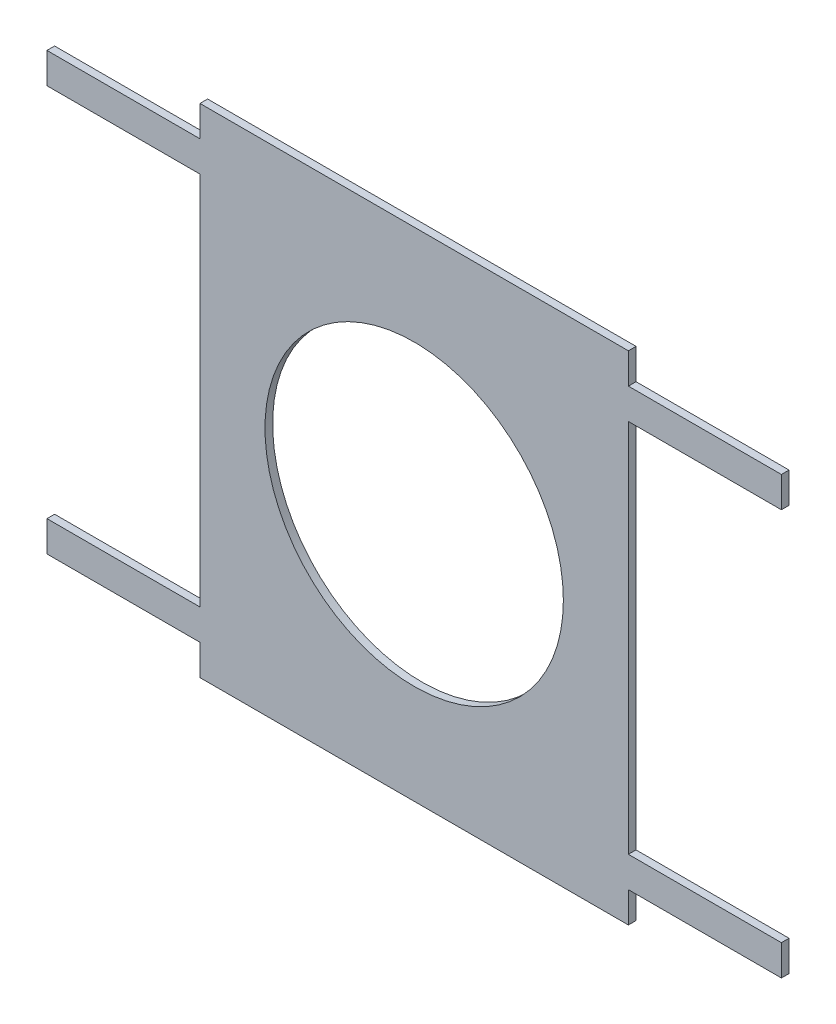
ISO-10303-21;
HEADER;
FILE_DESCRIPTION(('STEP AP214'),'2;1');
FILE_NAME('part.step','',(''),(''),'','','');
FILE_SCHEMA(('AUTOMOTIVE_DESIGN { 1 0 10303 214 1 1 1 1 }'));
ENDSEC;
DATA;
#1=APPLICATION_CONTEXT('core data for automotive mechanical design processes');
#2=APPLICATION_PROTOCOL_DEFINITION('international standard','automotive_design',2000,#1);
#3=PRODUCT_CONTEXT('',#1,'mechanical');
#4=PRODUCT('Part','Part','',(#3));
#5=PRODUCT_RELATED_PRODUCT_CATEGORY('part','',(#4));
#6=PRODUCT_DEFINITION_FORMATION('','',#4);
#7=PRODUCT_DEFINITION_CONTEXT('part definition',#1,'design');
#8=PRODUCT_DEFINITION('design','',#6,#7);
#9=PRODUCT_DEFINITION_SHAPE('','',#8);
#10=(LENGTH_UNIT() NAMED_UNIT(*) SI_UNIT(.MILLI.,.METRE.));
#11=(NAMED_UNIT(*) PLANE_ANGLE_UNIT() SI_UNIT($,.RADIAN.));
#12=(NAMED_UNIT(*) SI_UNIT($,.STERADIAN.) SOLID_ANGLE_UNIT());
#13=UNCERTAINTY_MEASURE_WITH_UNIT(LENGTH_MEASURE(1.E-05),#10,'distance_accuracy_value','');
#14=(GEOMETRIC_REPRESENTATION_CONTEXT(3) GLOBAL_UNCERTAINTY_ASSIGNED_CONTEXT((#13)) GLOBAL_UNIT_ASSIGNED_CONTEXT((#10,
#11,#12)) REPRESENTATION_CONTEXT('',''));
#15=CARTESIAN_POINT('',(0.,0.,0.));
#16=DIRECTION('',(0.,0.,1.));
#17=DIRECTION('',(1.,0.,0.));
#18=AXIS2_PLACEMENT_3D('',#15,#16,#17);
#19=CARTESIAN_POINT('',(0.,-1.625,0.05));
#20=DIRECTION('',(0.,1.,0.));
#21=DIRECTION('',(0.,0.,1.));
#22=AXIS2_PLACEMENT_3D('',#19,#20,#21);
#23=PLANE('',#22);
#24=DIRECTION('',(1.,0.,0.));
#25=VECTOR('',#24,1.);
#26=CARTESIAN_POINT('',(0.,-1.625,0.));
#27=LINE('',#26,#25);
#28=CARTESIAN_POINT('',(-1.4,-1.625,0.));
#29=VERTEX_POINT('',#28);
#30=CARTESIAN_POINT('',(1.4,-1.625,0.));
#31=VERTEX_POINT('',#30);
#32=EDGE_CURVE('E222',#29,#31,#27,.T.);
#33=ORIENTED_EDGE('',*,*,#32,.T.);
#34=DIRECTION('',(0.,0.,-1.));
#35=VECTOR('',#34,1.);
#36=CARTESIAN_POINT('',(1.4,-1.625,0.05));
#37=LINE('',#36,#35);
#38=CARTESIAN_POINT('',(1.4,-1.625,0.05));
#39=VERTEX_POINT('',#38);
#40=EDGE_CURVE('E11',#39,#31,#37,.T.);
#41=ORIENTED_EDGE('',*,*,#40,.F.);
#42=DIRECTION('',(1.,0.,0.));
#43=VECTOR('',#42,1.);
#44=CARTESIAN_POINT('',(0.,-1.625,0.05));
#45=LINE('',#44,#43);
#46=CARTESIAN_POINT('',(-1.4,-1.625,0.05));
#47=VERTEX_POINT('',#46);
#48=EDGE_CURVE('E411',#47,#39,#45,.T.);
#49=ORIENTED_EDGE('',*,*,#48,.F.);
#50=DIRECTION('',(0.,0.,-1.));
#51=VECTOR('',#50,1.);
#52=CARTESIAN_POINT('',(-1.4,-1.625,0.05));
#53=LINE('',#52,#51);
#54=EDGE_CURVE('E59',#47,#29,#53,.T.);
#55=ORIENTED_EDGE('',*,*,#54,.T.);
#56=EDGE_LOOP('',(#33,#41,#49,#55));
#57=FACE_BOUND('',#56,.T.);
#58=ADVANCED_FACE('F41',(#57),#23,.F.);
#59=CARTESIAN_POINT('',(1.4,0.,0.05));
#60=DIRECTION('',(-1.,0.,0.));
#61=DIRECTION('',(0.,0.,1.));
#62=AXIS2_PLACEMENT_3D('',#59,#60,#61);
#63=PLANE('',#62);
#64=DIRECTION('',(0.,1.,0.));
#65=VECTOR('',#64,1.);
#66=CARTESIAN_POINT('',(1.4,0.,0.));
#67=LINE('',#66,#65);
#68=CARTESIAN_POINT('',(1.4,-1.425,0.));
#69=VERTEX_POINT('',#68);
#70=EDGE_CURVE('E225',#31,#69,#67,.T.);
#71=ORIENTED_EDGE('',*,*,#70,.T.);
#72=DIRECTION('',(0.,0.,-1.));
#73=VECTOR('',#72,1.);
#74=CARTESIAN_POINT('',(1.4,-1.425,0.05));
#75=LINE('',#74,#73);
#76=CARTESIAN_POINT('',(1.4,-1.425,0.05));
#77=VERTEX_POINT('',#76);
#78=EDGE_CURVE('E51',#77,#69,#75,.T.);
#79=ORIENTED_EDGE('',*,*,#78,.F.);
#80=DIRECTION('',(0.,1.,0.));
#81=VECTOR('',#80,1.);
#82=CARTESIAN_POINT('',(1.4,0.,0.05));
#83=LINE('',#82,#81);
#84=EDGE_CURVE('E133',#39,#77,#83,.T.);
#85=ORIENTED_EDGE('',*,*,#84,.F.);
#86=ORIENTED_EDGE('',*,*,#40,.T.);
#87=EDGE_LOOP('',(#71,#79,#85,#86));
#88=FACE_BOUND('',#87,.T.);
#89=ADVANCED_FACE('F469',(#88),#63,.F.);
#90=CARTESIAN_POINT('',(0.,-1.425,0.05));
#91=DIRECTION('',(0.,1.,0.));
#92=DIRECTION('',(-1.,0.,0.));
#93=AXIS2_PLACEMENT_3D('',#90,#91,#92);
#94=PLANE('',#93);
#95=DIRECTION('',(1.,0.,0.));
#96=VECTOR('',#95,1.);
#97=CARTESIAN_POINT('',(0.,-1.425,0.));
#98=LINE('',#97,#96);
#99=CARTESIAN_POINT('',(2.4,-1.425,0.));
#100=VERTEX_POINT('',#99);
#101=EDGE_CURVE('E228',#69,#100,#98,.T.);
#102=ORIENTED_EDGE('',*,*,#101,.T.);
#103=DIRECTION('',(0.,0.,-1.));
#104=VECTOR('',#103,1.);
#105=CARTESIAN_POINT('',(2.4,-1.425,0.05));
#106=LINE('',#105,#104);
#107=CARTESIAN_POINT('',(2.4,-1.425,0.05));
#108=VERTEX_POINT('',#107);
#109=EDGE_CURVE('E330',#108,#100,#106,.T.);
#110=ORIENTED_EDGE('',*,*,#109,.F.);
#111=DIRECTION('',(1.,0.,0.));
#112=VECTOR('',#111,1.);
#113=CARTESIAN_POINT('',(0.,-1.425,0.05));
#114=LINE('',#113,#112);
#115=EDGE_CURVE('E340',#77,#108,#114,.T.);
#116=ORIENTED_EDGE('',*,*,#115,.F.);
#117=ORIENTED_EDGE('',*,*,#78,.T.);
#118=EDGE_LOOP('',(#102,#110,#116,#117));
#119=FACE_BOUND('',#118,.T.);
#120=ADVANCED_FACE('F338',(#119),#94,.F.);
#121=CARTESIAN_POINT('',(2.4,0.,0.05));
#122=DIRECTION('',(-1.,0.,0.));
#123=DIRECTION('',(0.,0.,1.));
#124=AXIS2_PLACEMENT_3D('',#121,#122,#123);
#125=PLANE('',#124);
#126=DIRECTION('',(0.,1.,0.));
#127=VECTOR('',#126,1.);
#128=CARTESIAN_POINT('',(2.4,0.,0.));
#129=LINE('',#128,#127);
#130=CARTESIAN_POINT('',(2.4,-1.225,0.));
#131=VERTEX_POINT('',#130);
#132=EDGE_CURVE('E233',#100,#131,#129,.T.);
#133=ORIENTED_EDGE('',*,*,#132,.T.);
#134=DIRECTION('',(0.,0.,-1.));
#135=VECTOR('',#134,1.);
#136=CARTESIAN_POINT('',(2.4,-1.225,0.05));
#137=LINE('',#136,#135);
#138=CARTESIAN_POINT('',(2.4,-1.225,0.05));
#139=VERTEX_POINT('',#138);
#140=EDGE_CURVE('E327',#139,#131,#137,.T.);
#141=ORIENTED_EDGE('',*,*,#140,.F.);
#142=DIRECTION('',(0.,1.,0.));
#143=VECTOR('',#142,1.);
#144=CARTESIAN_POINT('',(2.4,0.,0.05));
#145=LINE('',#144,#143);
#146=EDGE_CURVE('E351',#108,#139,#145,.T.);
#147=ORIENTED_EDGE('',*,*,#146,.F.);
#148=ORIENTED_EDGE('',*,*,#109,.T.);
#149=EDGE_LOOP('',(#133,#141,#147,#148));
#150=FACE_BOUND('',#149,.T.);
#151=ADVANCED_FACE('F348',(#150),#125,.F.);
#152=CARTESIAN_POINT('',(0.,-1.225,0.05));
#153=DIRECTION('',(0.,1.,0.));
#154=DIRECTION('',(0.,0.,1.));
#155=AXIS2_PLACEMENT_3D('',#152,#153,#154);
#156=PLANE('',#155);
#157=DIRECTION('',(1.,0.,0.));
#158=VECTOR('',#157,1.);
#159=CARTESIAN_POINT('',(0.,-1.225,0.));
#160=LINE('',#159,#158);
#161=CARTESIAN_POINT('',(1.4,-1.225,0.));
#162=VERTEX_POINT('',#161);
#163=EDGE_CURVE('E237',#162,#131,#160,.T.);
#164=ORIENTED_EDGE('',*,*,#163,.F.);
#165=DIRECTION('',(0.,0.,-1.));
#166=VECTOR('',#165,1.);
#167=CARTESIAN_POINT('',(1.4,-1.225,0.05));
#168=LINE('',#167,#166);
#169=CARTESIAN_POINT('',(1.4,-1.225,0.05));
#170=VERTEX_POINT('',#169);
#171=EDGE_CURVE('E324',#170,#162,#168,.T.);
#172=ORIENTED_EDGE('',*,*,#171,.F.);
#173=DIRECTION('',(1.,0.,0.));
#174=VECTOR('',#173,1.);
#175=CARTESIAN_POINT('',(0.,-1.225,0.05));
#176=LINE('',#175,#174);
#177=EDGE_CURVE('E354',#170,#139,#176,.T.);
#178=ORIENTED_EDGE('',*,*,#177,.T.);
#179=ORIENTED_EDGE('',*,*,#140,.T.);
#180=EDGE_LOOP('',(#164,#172,#178,#179));
#181=FACE_BOUND('',#180,.T.);
#182=ADVANCED_FACE('F480',(#181),#156,.T.);
#183=CARTESIAN_POINT('',(1.4,1.225,0.));
#184=VERTEX_POINT('',#183);
#185=EDGE_CURVE('E230',#162,#184,#67,.T.);
#186=ORIENTED_EDGE('',*,*,#185,.T.);
#187=DIRECTION('',(0.,0.,-1.));
#188=VECTOR('',#187,1.);
#189=CARTESIAN_POINT('',(1.4,1.225,0.05));
#190=LINE('',#189,#188);
#191=CARTESIAN_POINT('',(1.4,1.225,0.05));
#192=VERTEX_POINT('',#191);
#193=EDGE_CURVE('E320',#192,#184,#190,.T.);
#194=ORIENTED_EDGE('',*,*,#193,.F.);
#195=EDGE_CURVE('E358',#170,#192,#83,.T.);
#196=ORIENTED_EDGE('',*,*,#195,.F.);
#197=ORIENTED_EDGE('',*,*,#171,.T.);
#198=EDGE_LOOP('',(#186,#194,#196,#197));
#199=FACE_BOUND('',#198,.T.);
#200=ADVANCED_FACE('F426',(#199),#63,.F.);
#201=CARTESIAN_POINT('',(0.,1.225,0.05));
#202=DIRECTION('',(0.,1.,0.));
#203=DIRECTION('',(0.,0.,1.));
#204=AXIS2_PLACEMENT_3D('',#201,#202,#203);
#205=PLANE('',#204);
#206=DIRECTION('',(1.,0.,0.));
#207=VECTOR('',#206,1.);
#208=CARTESIAN_POINT('',(0.,1.225,0.));
#209=LINE('',#208,#207);
#210=CARTESIAN_POINT('',(2.4,1.225,0.));
#211=VERTEX_POINT('',#210);
#212=EDGE_CURVE('E241',#184,#211,#209,.T.);
#213=ORIENTED_EDGE('',*,*,#212,.T.);
#214=DIRECTION('',(0.,0.,-1.));
#215=VECTOR('',#214,1.);
#216=CARTESIAN_POINT('',(2.4,1.225,0.05));
#217=LINE('',#216,#215);
#218=CARTESIAN_POINT('',(2.4,1.225,0.05));
#219=VERTEX_POINT('',#218);
#220=EDGE_CURVE('E317',#219,#211,#217,.T.);
#221=ORIENTED_EDGE('',*,*,#220,.F.);
#222=DIRECTION('',(1.,0.,0.));
#223=VECTOR('',#222,1.);
#224=CARTESIAN_POINT('',(0.,1.225,0.05));
#225=LINE('',#224,#223);
#226=EDGE_CURVE('E363',#192,#219,#225,.T.);
#227=ORIENTED_EDGE('',*,*,#226,.F.);
#228=ORIENTED_EDGE('',*,*,#193,.T.);
#229=EDGE_LOOP('',(#213,#221,#227,#228));
#230=FACE_BOUND('',#229,.T.);
#231=ADVANCED_FACE('F429',(#230),#205,.F.);
#232=CARTESIAN_POINT('',(2.4,0.,0.05));
#233=DIRECTION('',(1.,0.,0.));
#234=DIRECTION('',(0.,0.,-1.));
#235=AXIS2_PLACEMENT_3D('',#232,#233,#234);
#236=PLANE('',#235);
#237=DIRECTION('',(0.,-1.,0.));
#238=VECTOR('',#237,1.);
#239=CARTESIAN_POINT('',(2.4,0.,0.));
#240=LINE('',#239,#238);
#241=CARTESIAN_POINT('',(2.4,1.425,0.));
#242=VERTEX_POINT('',#241);
#243=EDGE_CURVE('E245',#242,#211,#240,.T.);
#244=ORIENTED_EDGE('',*,*,#243,.F.);
#245=DIRECTION('',(0.,0.,-1.));
#246=VECTOR('',#245,1.);
#247=CARTESIAN_POINT('',(2.4,1.425,0.05));
#248=LINE('',#247,#246);
#249=CARTESIAN_POINT('',(2.4,1.425,0.05));
#250=VERTEX_POINT('',#249);
#251=EDGE_CURVE('E314',#250,#242,#248,.T.);
#252=ORIENTED_EDGE('',*,*,#251,.F.);
#253=DIRECTION('',(0.,-1.,0.));
#254=VECTOR('',#253,1.);
#255=CARTESIAN_POINT('',(2.4,0.,0.05));
#256=LINE('',#255,#254);
#257=EDGE_CURVE('E366',#250,#219,#256,.T.);
#258=ORIENTED_EDGE('',*,*,#257,.T.);
#259=ORIENTED_EDGE('',*,*,#220,.T.);
#260=EDGE_LOOP('',(#244,#252,#258,#259));
#261=FACE_BOUND('',#260,.T.);
#262=ADVANCED_FACE('F432',(#261),#236,.T.);
#263=CARTESIAN_POINT('',(0.,1.425,0.05));
#264=DIRECTION('',(0.,1.,0.));
#265=DIRECTION('',(-1.,0.,0.));
#266=AXIS2_PLACEMENT_3D('',#263,#264,#265);
#267=PLANE('',#266);
#268=DIRECTION('',(1.,0.,0.));
#269=VECTOR('',#268,1.);
#270=CARTESIAN_POINT('',(0.,1.425,0.));
#271=LINE('',#270,#269);
#272=CARTESIAN_POINT('',(1.4,1.425,0.));
#273=VERTEX_POINT('',#272);
#274=EDGE_CURVE('E249',#273,#242,#271,.T.);
#275=ORIENTED_EDGE('',*,*,#274,.F.);
#276=DIRECTION('',(0.,0.,-1.));
#277=VECTOR('',#276,1.);
#278=CARTESIAN_POINT('',(1.4,1.425,0.05));
#279=LINE('',#278,#277);
#280=CARTESIAN_POINT('',(1.4,1.425,0.05));
#281=VERTEX_POINT('',#280);
#282=EDGE_CURVE('E311',#281,#273,#279,.T.);
#283=ORIENTED_EDGE('',*,*,#282,.F.);
#284=DIRECTION('',(1.,0.,0.));
#285=VECTOR('',#284,1.);
#286=CARTESIAN_POINT('',(0.,1.425,0.05));
#287=LINE('',#286,#285);
#288=EDGE_CURVE('E370',#281,#250,#287,.T.);
#289=ORIENTED_EDGE('',*,*,#288,.T.);
#290=ORIENTED_EDGE('',*,*,#251,.T.);
#291=EDGE_LOOP('',(#275,#283,#289,#290));
#292=FACE_BOUND('',#291,.T.);
#293=ADVANCED_FACE('F436',(#292),#267,.T.);
#294=CARTESIAN_POINT('',(1.4,1.625,0.));
#295=VERTEX_POINT('',#294);
#296=EDGE_CURVE('E229',#273,#295,#67,.T.);
#297=ORIENTED_EDGE('',*,*,#296,.T.);
#298=DIRECTION('',(0.,0.,-1.));
#299=VECTOR('',#298,1.);
#300=CARTESIAN_POINT('',(1.4,1.625,0.05));
#301=LINE('',#300,#299);
#302=CARTESIAN_POINT('',(1.4,1.625,0.05));
#303=VERTEX_POINT('',#302);
#304=EDGE_CURVE('E308',#303,#295,#301,.T.);
#305=ORIENTED_EDGE('',*,*,#304,.F.);
#306=EDGE_CURVE('E374',#281,#303,#83,.T.);
#307=ORIENTED_EDGE('',*,*,#306,.F.);
#308=ORIENTED_EDGE('',*,*,#282,.T.);
#309=EDGE_LOOP('',(#297,#305,#307,#308));
#310=FACE_BOUND('',#309,.T.);
#311=ADVANCED_FACE('F442',(#310),#63,.F.);
#312=CARTESIAN_POINT('',(0.,1.625,0.05));
#313=DIRECTION('',(0.,1.,0.));
#314=DIRECTION('',(0.,0.,1.));
#315=AXIS2_PLACEMENT_3D('',#312,#313,#314);
#316=PLANE('',#315);
#317=DIRECTION('',(1.,0.,0.));
#318=VECTOR('',#317,1.);
#319=CARTESIAN_POINT('',(0.,1.625,0.));
#320=LINE('',#319,#318);
#321=CARTESIAN_POINT('',(-1.4,1.625,0.));
#322=VERTEX_POINT('',#321);
#323=EDGE_CURVE('E253',#322,#295,#320,.T.);
#324=ORIENTED_EDGE('',*,*,#323,.F.);
#325=DIRECTION('',(0.,0.,-1.));
#326=VECTOR('',#325,1.);
#327=CARTESIAN_POINT('',(-1.4,1.625,0.05));
#328=LINE('',#327,#326);
#329=CARTESIAN_POINT('',(-1.4,1.625,0.05));
#330=VERTEX_POINT('',#329);
#331=EDGE_CURVE('E305',#330,#322,#328,.T.);
#332=ORIENTED_EDGE('',*,*,#331,.F.);
#333=DIRECTION('',(1.,0.,0.));
#334=VECTOR('',#333,1.);
#335=CARTESIAN_POINT('',(0.,1.625,0.05));
#336=LINE('',#335,#334);
#337=EDGE_CURVE('E375',#330,#303,#336,.T.);
#338=ORIENTED_EDGE('',*,*,#337,.T.);
#339=ORIENTED_EDGE('',*,*,#304,.T.);
#340=EDGE_LOOP('',(#324,#332,#338,#339));
#341=FACE_BOUND('',#340,.T.);
#342=ADVANCED_FACE('F457',(#341),#316,.T.);
#343=CARTESIAN_POINT('',(-1.4,0.,0.05));
#344=DIRECTION('',(-1.,0.,0.));
#345=DIRECTION('',(0.,0.,1.));
#346=AXIS2_PLACEMENT_3D('',#343,#344,#345);
#347=PLANE('',#346);
#348=DIRECTION('',(0.,1.,0.));
#349=VECTOR('',#348,1.);
#350=CARTESIAN_POINT('',(-1.4,0.,0.));
#351=LINE('',#350,#349);
#352=CARTESIAN_POINT('',(-1.4,1.425,0.));
#353=VERTEX_POINT('',#352);
#354=EDGE_CURVE('E257',#353,#322,#351,.T.);
#355=ORIENTED_EDGE('',*,*,#354,.F.);
#356=DIRECTION('',(0.,0.,-1.));
#357=VECTOR('',#356,1.);
#358=CARTESIAN_POINT('',(-1.4,1.425,0.05));
#359=LINE('',#358,#357);
#360=CARTESIAN_POINT('',(-1.4,1.425,0.05));
#361=VERTEX_POINT('',#360);
#362=EDGE_CURVE('E302',#361,#353,#359,.T.);
#363=ORIENTED_EDGE('',*,*,#362,.F.);
#364=DIRECTION('',(0.,1.,0.));
#365=VECTOR('',#364,1.);
#366=CARTESIAN_POINT('',(-1.4,0.,0.05));
#367=LINE('',#366,#365);
#368=EDGE_CURVE('E215',#361,#330,#367,.T.);
#369=ORIENTED_EDGE('',*,*,#368,.T.);
#370=ORIENTED_EDGE('',*,*,#331,.T.);
#371=EDGE_LOOP('',(#355,#363,#369,#370));
#372=FACE_BOUND('',#371,.T.);
#373=ADVANCED_FACE('F448',(#372),#347,.T.);
#374=CARTESIAN_POINT('',(0.,1.425,0.05));
#375=DIRECTION('',(0.,-1.,0.));
#376=DIRECTION('',(1.,0.,0.));
#377=AXIS2_PLACEMENT_3D('',#374,#375,#376);
#378=PLANE('',#377);
#379=DIRECTION('',(-1.,0.,0.));
#380=VECTOR('',#379,1.);
#381=CARTESIAN_POINT('',(0.,1.425,0.));
#382=LINE('',#381,#380);
#383=CARTESIAN_POINT('',(-2.4,1.425,0.));
#384=VERTEX_POINT('',#383);
#385=EDGE_CURVE('E261',#353,#384,#382,.T.);
#386=ORIENTED_EDGE('',*,*,#385,.T.);
#387=DIRECTION('',(0.,0.,-1.));
#388=VECTOR('',#387,1.);
#389=CARTESIAN_POINT('',(-2.4,1.425,0.05));
#390=LINE('',#389,#388);
#391=CARTESIAN_POINT('',(-2.4,1.425,0.05));
#392=VERTEX_POINT('',#391);
#393=EDGE_CURVE('E298',#392,#384,#390,.T.);
#394=ORIENTED_EDGE('',*,*,#393,.F.);
#395=DIRECTION('',(-1.,0.,0.));
#396=VECTOR('',#395,1.);
#397=CARTESIAN_POINT('',(0.,1.425,0.05));
#398=LINE('',#397,#396);
#399=EDGE_CURVE('E381',#361,#392,#398,.T.);
#400=ORIENTED_EDGE('',*,*,#399,.F.);
#401=ORIENTED_EDGE('',*,*,#362,.T.);
#402=EDGE_LOOP('',(#386,#394,#400,#401));
#403=FACE_BOUND('',#402,.T.);
#404=ADVANCED_FACE('F454',(#403),#378,.F.);
#405=CARTESIAN_POINT('',(-2.4,0.,0.05));
#406=DIRECTION('',(1.,0.,0.));
#407=DIRECTION('',(0.,0.,-1.));
#408=AXIS2_PLACEMENT_3D('',#405,#406,#407);
#409=PLANE('',#408);
#410=DIRECTION('',(0.,-1.,0.));
#411=VECTOR('',#410,1.);
#412=CARTESIAN_POINT('',(-2.4,0.,0.));
#413=LINE('',#412,#411);
#414=CARTESIAN_POINT('',(-2.4,1.225,0.));
#415=VERTEX_POINT('',#414);
#416=EDGE_CURVE('E266',#384,#415,#413,.T.);
#417=ORIENTED_EDGE('',*,*,#416,.T.);
#418=DIRECTION('',(0.,0.,-1.));
#419=VECTOR('',#418,1.);
#420=CARTESIAN_POINT('',(-2.4,1.225,0.05));
#421=LINE('',#420,#419);
#422=CARTESIAN_POINT('',(-2.4,1.225,0.05));
#423=VERTEX_POINT('',#422);
#424=EDGE_CURVE('E295',#423,#415,#421,.T.);
#425=ORIENTED_EDGE('',*,*,#424,.F.);
#426=DIRECTION('',(0.,-1.,0.));
#427=VECTOR('',#426,1.);
#428=CARTESIAN_POINT('',(-2.4,0.,0.05));
#429=LINE('',#428,#427);
#430=EDGE_CURVE('E384',#392,#423,#429,.T.);
#431=ORIENTED_EDGE('',*,*,#430,.F.);
#432=ORIENTED_EDGE('',*,*,#393,.T.);
#433=EDGE_LOOP('',(#417,#425,#431,#432));
#434=FACE_BOUND('',#433,.T.);
#435=ADVANCED_FACE('F456',(#434),#409,.F.);
#436=CARTESIAN_POINT('',(0.,1.225,0.05));
#437=DIRECTION('',(0.,-1.,0.));
#438=DIRECTION('',(0.,0.,-1.));
#439=AXIS2_PLACEMENT_3D('',#436,#437,#438);
#440=PLANE('',#439);
#441=DIRECTION('',(-1.,0.,0.));
#442=VECTOR('',#441,1.);
#443=CARTESIAN_POINT('',(0.,1.225,0.));
#444=LINE('',#443,#442);
#445=CARTESIAN_POINT('',(-1.4,1.225,0.));
#446=VERTEX_POINT('',#445);
#447=EDGE_CURVE('E270',#446,#415,#444,.T.);
#448=ORIENTED_EDGE('',*,*,#447,.F.);
#449=DIRECTION('',(0.,0.,-1.));
#450=VECTOR('',#449,1.);
#451=CARTESIAN_POINT('',(-1.4,1.225,0.05));
#452=LINE('',#451,#450);
#453=CARTESIAN_POINT('',(-1.4,1.225,0.05));
#454=VERTEX_POINT('',#453);
#455=EDGE_CURVE('E292',#454,#446,#452,.T.);
#456=ORIENTED_EDGE('',*,*,#455,.F.);
#457=DIRECTION('',(-1.,0.,0.));
#458=VECTOR('',#457,1.);
#459=CARTESIAN_POINT('',(0.,1.225,0.05));
#460=LINE('',#459,#458);
#461=EDGE_CURVE('E387',#454,#423,#460,.T.);
#462=ORIENTED_EDGE('',*,*,#461,.T.);
#463=ORIENTED_EDGE('',*,*,#424,.T.);
#464=EDGE_LOOP('',(#448,#456,#462,#463));
#465=FACE_BOUND('',#464,.T.);
#466=ADVANCED_FACE('F401',(#465),#440,.T.);
#467=CARTESIAN_POINT('',(-1.4,-1.225,0.));
#468=VERTEX_POINT('',#467);
#469=EDGE_CURVE('E263',#468,#446,#351,.T.);
#470=ORIENTED_EDGE('',*,*,#469,.F.);
#471=DIRECTION('',(0.,0.,-1.));
#472=VECTOR('',#471,1.);
#473=CARTESIAN_POINT('',(-1.4,-1.225,0.05));
#474=LINE('',#473,#472);
#475=CARTESIAN_POINT('',(-1.4,-1.225,0.05));
#476=VERTEX_POINT('',#475);
#477=EDGE_CURVE('E289',#476,#468,#474,.T.);
#478=ORIENTED_EDGE('',*,*,#477,.F.);
#479=EDGE_CURVE('E214',#476,#454,#367,.T.);
#480=ORIENTED_EDGE('',*,*,#479,.T.);
#481=ORIENTED_EDGE('',*,*,#455,.T.);
#482=EDGE_LOOP('',(#470,#478,#480,#481));
#483=FACE_BOUND('',#482,.T.);
#484=ADVANCED_FACE('F395',(#483),#347,.T.);
#485=CARTESIAN_POINT('',(0.,-1.225,0.05));
#486=DIRECTION('',(0.,-1.,0.));
#487=DIRECTION('',(0.,0.,-1.));
#488=AXIS2_PLACEMENT_3D('',#485,#486,#487);
#489=PLANE('',#488);
#490=DIRECTION('',(-1.,0.,0.));
#491=VECTOR('',#490,1.);
#492=CARTESIAN_POINT('',(0.,-1.225,0.));
#493=LINE('',#492,#491);
#494=CARTESIAN_POINT('',(-2.4,-1.225,0.));
#495=VERTEX_POINT('',#494);
#496=EDGE_CURVE('E274',#468,#495,#493,.T.);
#497=ORIENTED_EDGE('',*,*,#496,.T.);
#498=DIRECTION('',(0.,0.,-1.));
#499=VECTOR('',#498,1.);
#500=CARTESIAN_POINT('',(-2.4,-1.225,0.05));
#501=LINE('',#500,#499);
#502=CARTESIAN_POINT('',(-2.4,-1.225,0.05));
#503=VERTEX_POINT('',#502);
#504=EDGE_CURVE('E195',#503,#495,#501,.T.);
#505=ORIENTED_EDGE('',*,*,#504,.F.);
#506=DIRECTION('',(-1.,0.,0.));
#507=VECTOR('',#506,1.);
#508=CARTESIAN_POINT('',(0.,-1.225,0.05));
#509=LINE('',#508,#507);
#510=EDGE_CURVE('E204',#476,#503,#509,.T.);
#511=ORIENTED_EDGE('',*,*,#510,.F.);
#512=ORIENTED_EDGE('',*,*,#477,.T.);
#513=EDGE_LOOP('',(#497,#505,#511,#512));
#514=FACE_BOUND('',#513,.T.);
#515=ADVANCED_FACE('F543',(#514),#489,.F.);
#516=CARTESIAN_POINT('',(-2.4,0.,0.05));
#517=DIRECTION('',(-1.,0.,0.));
#518=DIRECTION('',(0.,0.,1.));
#519=AXIS2_PLACEMENT_3D('',#516,#517,#518);
#520=PLANE('',#519);
#521=DIRECTION('',(0.,1.,0.));
#522=VECTOR('',#521,1.);
#523=CARTESIAN_POINT('',(-2.4,0.,0.));
#524=LINE('',#523,#522);
#525=CARTESIAN_POINT('',(-2.4,-1.425,0.));
#526=VERTEX_POINT('',#525);
#527=EDGE_CURVE('E190',#526,#495,#524,.T.);
#528=ORIENTED_EDGE('',*,*,#527,.F.);
#529=DIRECTION('',(0.,0.,-1.));
#530=VECTOR('',#529,1.);
#531=CARTESIAN_POINT('',(-2.4,-1.425,0.05));
#532=LINE('',#531,#530);
#533=CARTESIAN_POINT('',(-2.4,-1.425,0.05));
#534=VERTEX_POINT('',#533);
#535=EDGE_CURVE('E185',#534,#526,#532,.T.);
#536=ORIENTED_EDGE('',*,*,#535,.F.);
#537=DIRECTION('',(0.,1.,0.));
#538=VECTOR('',#537,1.);
#539=CARTESIAN_POINT('',(-2.4,0.,0.05));
#540=LINE('',#539,#538);
#541=EDGE_CURVE('E188',#534,#503,#540,.T.);
#542=ORIENTED_EDGE('',*,*,#541,.T.);
#543=ORIENTED_EDGE('',*,*,#504,.T.);
#544=EDGE_LOOP('',(#528,#536,#542,#543));
#545=FACE_BOUND('',#544,.T.);
#546=ADVANCED_FACE('F187',(#545),#520,.T.);
#547=CARTESIAN_POINT('',(0.,-1.425,0.05));
#548=DIRECTION('',(0.,-1.,0.));
#549=DIRECTION('',(1.,0.,0.));
#550=AXIS2_PLACEMENT_3D('',#547,#548,#549);
#551=PLANE('',#550);
#552=DIRECTION('',(-1.,0.,0.));
#553=VECTOR('',#552,1.);
#554=CARTESIAN_POINT('',(0.,-1.425,0.));
#555=LINE('',#554,#553);
#556=CARTESIAN_POINT('',(-1.4,-1.425,0.));
#557=VERTEX_POINT('',#556);
#558=EDGE_CURVE('E280',#557,#526,#555,.T.);
#559=ORIENTED_EDGE('',*,*,#558,.F.);
#560=DIRECTION('',(0.,0.,-1.));
#561=VECTOR('',#560,1.);
#562=CARTESIAN_POINT('',(-1.4,-1.425,0.05));
#563=LINE('',#562,#561);
#564=CARTESIAN_POINT('',(-1.4,-1.425,0.05));
#565=VERTEX_POINT('',#564);
#566=EDGE_CURVE('E121',#565,#557,#563,.T.);
#567=ORIENTED_EDGE('',*,*,#566,.F.);
#568=DIRECTION('',(-1.,0.,0.));
#569=VECTOR('',#568,1.);
#570=CARTESIAN_POINT('',(0.,-1.425,0.05));
#571=LINE('',#570,#569);
#572=EDGE_CURVE('E201',#565,#534,#571,.T.);
#573=ORIENTED_EDGE('',*,*,#572,.T.);
#574=ORIENTED_EDGE('',*,*,#535,.T.);
#575=EDGE_LOOP('',(#559,#567,#573,#574));
#576=FACE_BOUND('',#575,.T.);
#577=ADVANCED_FACE('F208',(#576),#551,.T.);
#578=CARTESIAN_POINT('',(0.,0.,0.05));
#579=DIRECTION('',(0.,0.,-1.));
#580=DIRECTION('',(-1.,0.,0.));
#581=AXIS2_PLACEMENT_3D('',#578,#579,#580);
#582=CYLINDRICAL_SURFACE('',#581,0.975);
#583=CARTESIAN_POINT('',(0.,0.,0.05));
#584=DIRECTION('',(0.,0.,1.));
#585=DIRECTION('',(1.,0.,0.));
#586=AXIS2_PLACEMENT_3D('',#583,#584,#585);
#587=CIRCLE('',#586,0.975);
#588=CARTESIAN_POINT('',(0.975,0.,0.05));
#589=VERTEX_POINT('',#588);
#590=EDGE_CURVE('E408',#589,#589,#587,.T.);
#591=ORIENTED_EDGE('',*,*,#590,.T.);
#592=EDGE_LOOP('',(#591));
#593=FACE_BOUND('',#592,.T.);
#594=CARTESIAN_POINT('',(0.,0.,0.));
#595=DIRECTION('',(0.,0.,1.));
#596=DIRECTION('',(1.,0.,0.));
#597=AXIS2_PLACEMENT_3D('',#594,#595,#596);
#598=CIRCLE('',#597,0.975);
#599=CARTESIAN_POINT('',(0.975,0.,0.));
#600=VERTEX_POINT('',#599);
#601=EDGE_CURVE('E218',#600,#600,#598,.T.);
#602=ORIENTED_EDGE('',*,*,#601,.F.);
#603=EDGE_LOOP('',(#602));
#604=FACE_BOUND('',#603,.T.);
#605=ADVANCED_FACE('F43',(#593,#604),#582,.F.);
#606=EDGE_CURVE('E262',#29,#557,#351,.T.);
#607=ORIENTED_EDGE('',*,*,#606,.F.);
#608=ORIENTED_EDGE('',*,*,#54,.F.);
#609=EDGE_CURVE('E210',#47,#565,#367,.T.);
#610=ORIENTED_EDGE('',*,*,#609,.T.);
#611=ORIENTED_EDGE('',*,*,#566,.T.);
#612=EDGE_LOOP('',(#607,#608,#610,#611));
#613=FACE_BOUND('',#612,.T.);
#614=ADVANCED_FACE('F467',(#613),#347,.T.);
#615=CARTESIAN_POINT('',(0.,0.,0.05));
#616=DIRECTION('',(0.,0.,1.));
#617=DIRECTION('',(1.,0.,0.));
#618=AXIS2_PLACEMENT_3D('',#615,#616,#617);
#619=PLANE('',#618);
#620=ORIENTED_EDGE('',*,*,#590,.F.);
#621=EDGE_LOOP('',(#620));
#622=FACE_BOUND('',#621,.T.);
#623=ORIENTED_EDGE('',*,*,#48,.T.);
#624=ORIENTED_EDGE('',*,*,#84,.T.);
#625=ORIENTED_EDGE('',*,*,#115,.T.);
#626=ORIENTED_EDGE('',*,*,#146,.T.);
#627=ORIENTED_EDGE('',*,*,#177,.F.);
#628=ORIENTED_EDGE('',*,*,#195,.T.);
#629=ORIENTED_EDGE('',*,*,#226,.T.);
#630=ORIENTED_EDGE('',*,*,#257,.F.);
#631=ORIENTED_EDGE('',*,*,#288,.F.);
#632=ORIENTED_EDGE('',*,*,#306,.T.);
#633=ORIENTED_EDGE('',*,*,#337,.F.);
#634=ORIENTED_EDGE('',*,*,#368,.F.);
#635=ORIENTED_EDGE('',*,*,#399,.T.);
#636=ORIENTED_EDGE('',*,*,#430,.T.);
#637=ORIENTED_EDGE('',*,*,#461,.F.);
#638=ORIENTED_EDGE('',*,*,#479,.F.);
#639=ORIENTED_EDGE('',*,*,#510,.T.);
#640=ORIENTED_EDGE('',*,*,#541,.F.);
#641=ORIENTED_EDGE('',*,*,#572,.F.);
#642=ORIENTED_EDGE('',*,*,#609,.F.);
#643=EDGE_LOOP('',(#623,#624,#625,#626,#627,#628,#629,#630,#631,#632,#633,#634,#635,#636,#637,
#638,#639,#640,#641,#642));
#644=FACE_BOUND('',#643,.T.);
#645=ADVANCED_FACE('F199',(#622,#644),#619,.T.);
#646=CARTESIAN_POINT('',(0.,0.,0.));
#647=DIRECTION('',(0.,0.,1.));
#648=DIRECTION('',(1.,0.,0.));
#649=AXIS2_PLACEMENT_3D('',#646,#647,#648);
#650=PLANE('',#649);
#651=ORIENTED_EDGE('',*,*,#601,.T.);
#652=EDGE_LOOP('',(#651));
#653=FACE_BOUND('',#652,.T.);
#654=ORIENTED_EDGE('',*,*,#32,.F.);
#655=ORIENTED_EDGE('',*,*,#606,.T.);
#656=ORIENTED_EDGE('',*,*,#558,.T.);
#657=ORIENTED_EDGE('',*,*,#527,.T.);
#658=ORIENTED_EDGE('',*,*,#496,.F.);
#659=ORIENTED_EDGE('',*,*,#469,.T.);
#660=ORIENTED_EDGE('',*,*,#447,.T.);
#661=ORIENTED_EDGE('',*,*,#416,.F.);
#662=ORIENTED_EDGE('',*,*,#385,.F.);
#663=ORIENTED_EDGE('',*,*,#354,.T.);
#664=ORIENTED_EDGE('',*,*,#323,.T.);
#665=ORIENTED_EDGE('',*,*,#296,.F.);
#666=ORIENTED_EDGE('',*,*,#274,.T.);
#667=ORIENTED_EDGE('',*,*,#243,.T.);
#668=ORIENTED_EDGE('',*,*,#212,.F.);
#669=ORIENTED_EDGE('',*,*,#185,.F.);
#670=ORIENTED_EDGE('',*,*,#163,.T.);
#671=ORIENTED_EDGE('',*,*,#132,.F.);
#672=ORIENTED_EDGE('',*,*,#101,.F.);
#673=ORIENTED_EDGE('',*,*,#70,.F.);
#674=EDGE_LOOP('',(#654,#655,#656,#657,#658,#659,#660,#661,#662,#663,#664,#665,#666,#667,#668,
#669,#670,#671,#672,#673));
#675=FACE_BOUND('',#674,.T.);
#676=ADVANCED_FACE('F343',(#653,#675),#650,.F.);
#677=CLOSED_SHELL('',(#58,#89,#120,#151,#182,#200,#231,#262,#293,#311,#342,#373,#404,#435,#466,
#484,#515,#546,#577,#605,#614,#645,#676));
#678=MANIFOLD_SOLID_BREP('B2',#677);
#679=ADVANCED_BREP_SHAPE_REPRESENTATION('',(#18,#678),#14);
#680=SHAPE_DEFINITION_REPRESENTATION(#9,#679);
ENDSEC;
END-ISO-10303-21;
